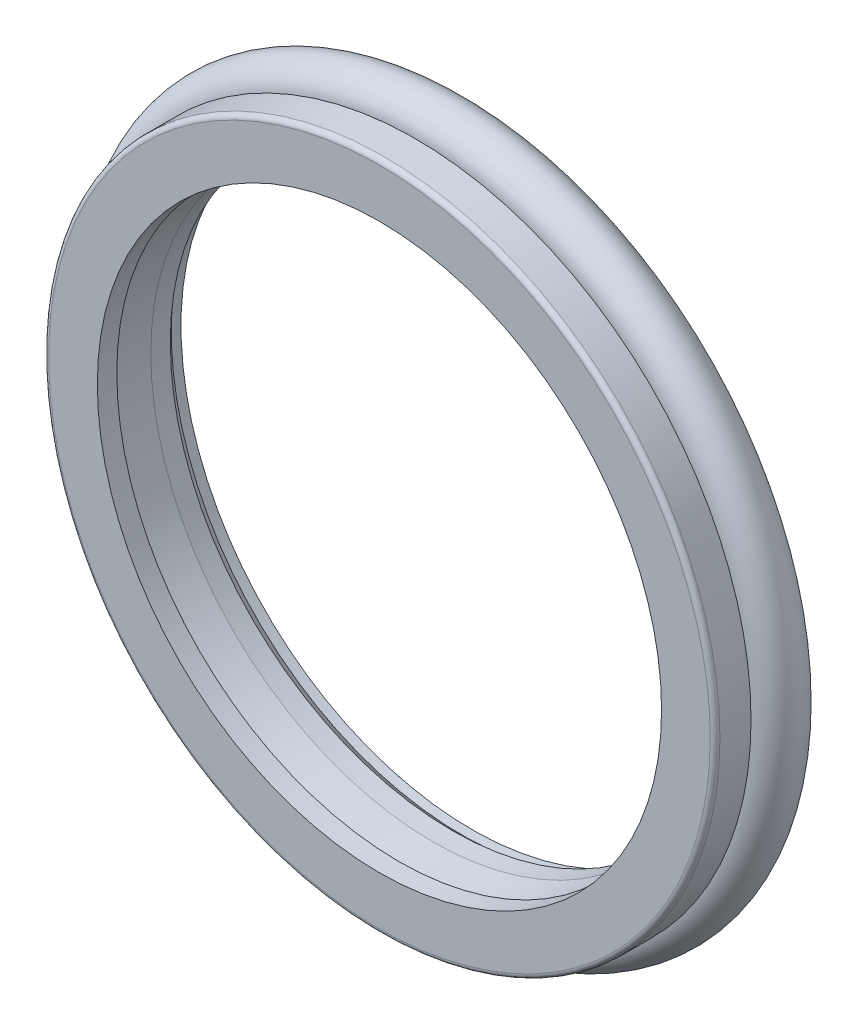
ISO-10303-21;
HEADER;
FILE_DESCRIPTION(('STEP AP214'),'2;1');
FILE_NAME('part.step','',(''),(''),'','','');
FILE_SCHEMA(('AUTOMOTIVE_DESIGN { 1 0 10303 214 1 1 1 1 }'));
ENDSEC;
DATA;
#1=APPLICATION_CONTEXT('core data for automotive mechanical design processes');
#2=APPLICATION_PROTOCOL_DEFINITION('international standard','automotive_design',2000,#1);
#3=PRODUCT_CONTEXT('',#1,'mechanical');
#4=PRODUCT('Part','Part','',(#3));
#5=PRODUCT_RELATED_PRODUCT_CATEGORY('part','',(#4));
#6=PRODUCT_DEFINITION_FORMATION('','',#4);
#7=PRODUCT_DEFINITION_CONTEXT('part definition',#1,'design');
#8=PRODUCT_DEFINITION('design','',#6,#7);
#9=PRODUCT_DEFINITION_SHAPE('','',#8);
#10=(LENGTH_UNIT() NAMED_UNIT(*) SI_UNIT(.MILLI.,.METRE.));
#11=(NAMED_UNIT(*) PLANE_ANGLE_UNIT() SI_UNIT($,.RADIAN.));
#12=(NAMED_UNIT(*) SI_UNIT($,.STERADIAN.) SOLID_ANGLE_UNIT());
#13=UNCERTAINTY_MEASURE_WITH_UNIT(LENGTH_MEASURE(1.E-05),#10,'distance_accuracy_value','');
#14=(GEOMETRIC_REPRESENTATION_CONTEXT(3) GLOBAL_UNCERTAINTY_ASSIGNED_CONTEXT((#13)) GLOBAL_UNIT_ASSIGNED_CONTEXT((#10,
#11,#12)) REPRESENTATION_CONTEXT('',''));
#15=CARTESIAN_POINT('',(0.,0.,0.));
#16=DIRECTION('',(0.,0.,1.));
#17=DIRECTION('',(1.,0.,0.));
#18=AXIS2_PLACEMENT_3D('',#15,#16,#17);
#19=CARTESIAN_POINT('',(0.,0.,-3.3));
#20=DIRECTION('',(0.,0.,1.));
#21=DIRECTION('',(1.,0.,0.));
#22=AXIS2_PLACEMENT_3D('',#19,#20,#21);
#23=TOROIDAL_SURFACE('',#22,17.05,1.3);
#24=CARTESIAN_POINT('',(18.35,0.,-3.3));
#25=VERTEX_POINT('',#24);
#26=VERTEX_LOOP('',#25);
#27=FACE_BOUND('',#26,.T.);
#28=ADVANCED_FACE('F49',(#27),#23,.T.);
#29=CLOSED_SHELL('',(#28));
#30=MANIFOLD_SOLID_BREP('B2',#29);
#31=CARTESIAN_POINT('',(0.,0.,0.));
#32=DIRECTION('',(0.,0.,1.));
#33=DIRECTION('',(1.,0.,0.));
#34=AXIS2_PLACEMENT_3D('',#31,#32,#33);
#35=CYLINDRICAL_SURFACE('',#34,14.5);
#36=CARTESIAN_POINT('',(0.,0.,-1.));
#37=DIRECTION('',(0.,0.,1.));
#38=DIRECTION('',(1.,0.,0.));
#39=AXIS2_PLACEMENT_3D('',#36,#37,#38);
#40=CIRCLE('',#39,14.5);
#41=CARTESIAN_POINT('',(14.5,0.,-1.));
#42=VERTEX_POINT('',#41);
#43=EDGE_CURVE('E48',#42,#42,#40,.T.);
#44=ORIENTED_EDGE('',*,*,#43,.F.);
#45=EDGE_LOOP('',(#44));
#46=FACE_BOUND('',#45,.T.);
#47=CARTESIAN_POINT('',(0.,0.,0.));
#48=DIRECTION('',(0.,0.,1.));
#49=DIRECTION('',(1.,0.,0.));
#50=AXIS2_PLACEMENT_3D('',#47,#48,#49);
#51=CIRCLE('',#50,14.5);
#52=CARTESIAN_POINT('',(14.5,0.,0.));
#53=VERTEX_POINT('',#52);
#54=EDGE_CURVE('E106',#53,#53,#51,.T.);
#55=ORIENTED_EDGE('',*,*,#54,.T.);
#56=EDGE_LOOP('',(#55));
#57=FACE_BOUND('',#56,.T.);
#58=ADVANCED_FACE('F66',(#46,#57),#35,.F.);
#59=CARTESIAN_POINT('',(0.,14.7,-1.));
#60=DIRECTION('',(0.,0.,1.));
#61=DIRECTION('',(1.,0.,0.));
#62=AXIS2_PLACEMENT_3D('',#59,#60,#61);
#63=PLANE('',#62);
#64=CARTESIAN_POINT('',(0.,0.,-1.));
#65=DIRECTION('',(0.,0.,1.));
#66=DIRECTION('',(1.,0.,0.));
#67=AXIS2_PLACEMENT_3D('',#64,#65,#66);
#68=CIRCLE('',#67,14.7);
#69=CARTESIAN_POINT('',(14.7,0.,-1.));
#70=VERTEX_POINT('',#69);
#71=EDGE_CURVE('E72',#70,#70,#68,.T.);
#72=ORIENTED_EDGE('',*,*,#71,.F.);
#73=EDGE_LOOP('',(#72));
#74=FACE_BOUND('',#73,.T.);
#75=ORIENTED_EDGE('',*,*,#43,.T.);
#76=EDGE_LOOP('',(#75));
#77=FACE_BOUND('',#76,.T.);
#78=ADVANCED_FACE('F167',(#74,#77),#63,.F.);
#79=CARTESIAN_POINT('',(0.,0.,-1.));
#80=DIRECTION('',(0.,0.,1.));
#81=DIRECTION('',(1.,0.,0.));
#82=AXIS2_PLACEMENT_3D('',#79,#80,#81);
#83=CONICAL_SURFACE('',#82,14.7,0.113792007143709);
#84=CARTESIAN_POINT('',(0.,0.,-2.75));
#85=DIRECTION('',(0.,0.,1.));
#86=DIRECTION('',(1.,0.,0.));
#87=AXIS2_PLACEMENT_3D('',#84,#85,#86);
#88=CIRCLE('',#87,14.5);
#89=CARTESIAN_POINT('',(14.5,0.,-2.75));
#90=VERTEX_POINT('',#89);
#91=EDGE_CURVE('E76',#90,#90,#88,.T.);
#92=ORIENTED_EDGE('',*,*,#91,.F.);
#93=EDGE_LOOP('',(#92));
#94=FACE_BOUND('',#93,.T.);
#95=ORIENTED_EDGE('',*,*,#71,.T.);
#96=EDGE_LOOP('',(#95));
#97=FACE_BOUND('',#96,.T.);
#98=ADVANCED_FACE('F162',(#94,#97),#83,.F.);
#99=CARTESIAN_POINT('',(0.,0.,0.));
#100=DIRECTION('',(0.,0.,1.));
#101=DIRECTION('',(1.,0.,0.));
#102=AXIS2_PLACEMENT_3D('',#99,#100,#101);
#103=CYLINDRICAL_SURFACE('',#102,14.5);
#104=CARTESIAN_POINT('',(0.,0.,-3.75));
#105=DIRECTION('',(0.,0.,1.));
#106=DIRECTION('',(1.,0.,0.));
#107=AXIS2_PLACEMENT_3D('',#104,#105,#106);
#108=CIRCLE('',#107,14.5);
#109=CARTESIAN_POINT('',(14.5,0.,-3.75));
#110=VERTEX_POINT('',#109);
#111=EDGE_CURVE('E80',#110,#110,#108,.T.);
#112=ORIENTED_EDGE('',*,*,#111,.F.);
#113=EDGE_LOOP('',(#112));
#114=FACE_BOUND('',#113,.T.);
#115=ORIENTED_EDGE('',*,*,#91,.T.);
#116=EDGE_LOOP('',(#115));
#117=FACE_BOUND('',#116,.T.);
#118=ADVANCED_FACE('F156',(#114,#117),#103,.F.);
#119=CARTESIAN_POINT('',(0.,0.,-3.75));
#120=DIRECTION('',(0.,0.,-1.));
#121=DIRECTION('',(-1.,0.,0.));
#122=AXIS2_PLACEMENT_3D('',#119,#120,#121);
#123=CONICAL_SURFACE('',#122,14.5,0.732815101786505);
#124=CARTESIAN_POINT('',(0.,0.,-4.25));
#125=DIRECTION('',(0.,0.,1.));
#126=DIRECTION('',(1.,0.,0.));
#127=AXIS2_PLACEMENT_3D('',#124,#125,#126);
#128=CIRCLE('',#127,14.95);
#129=CARTESIAN_POINT('',(14.95,0.,-4.25));
#130=VERTEX_POINT('',#129);
#131=EDGE_CURVE('E85',#130,#130,#128,.T.);
#132=ORIENTED_EDGE('',*,*,#131,.F.);
#133=EDGE_LOOP('',(#132));
#134=FACE_BOUND('',#133,.T.);
#135=ORIENTED_EDGE('',*,*,#111,.T.);
#136=EDGE_LOOP('',(#135));
#137=FACE_BOUND('',#136,.T.);
#138=ADVANCED_FACE('F150',(#134,#137),#123,.F.);
#139=CARTESIAN_POINT('',(0.,0.,0.));
#140=DIRECTION('',(0.,0.,1.));
#141=DIRECTION('',(1.,0.,0.));
#142=AXIS2_PLACEMENT_3D('',#139,#140,#141);
#143=CYLINDRICAL_SURFACE('',#142,14.95);
#144=CARTESIAN_POINT('',(0.,0.,-4.75));
#145=DIRECTION('',(0.,0.,1.));
#146=DIRECTION('',(1.,0.,0.));
#147=AXIS2_PLACEMENT_3D('',#144,#145,#146);
#148=CIRCLE('',#147,14.95);
#149=CARTESIAN_POINT('',(14.95,0.,-4.75));
#150=VERTEX_POINT('',#149);
#151=EDGE_CURVE('E88',#150,#150,#148,.T.);
#152=ORIENTED_EDGE('',*,*,#151,.F.);
#153=EDGE_LOOP('',(#152));
#154=FACE_BOUND('',#153,.T.);
#155=ORIENTED_EDGE('',*,*,#131,.T.);
#156=EDGE_LOOP('',(#155));
#157=FACE_BOUND('',#156,.T.);
#158=ADVANCED_FACE('F144',(#154,#157),#143,.F.);
#159=CARTESIAN_POINT('',(0.,15.75,-4.75));
#160=DIRECTION('',(0.,0.,1.));
#161=DIRECTION('',(1.,0.,0.));
#162=AXIS2_PLACEMENT_3D('',#159,#160,#161);
#163=PLANE('',#162);
#164=CARTESIAN_POINT('',(0.,0.,-4.75));
#165=DIRECTION('',(0.,0.,1.));
#166=DIRECTION('',(1.,0.,0.));
#167=AXIS2_PLACEMENT_3D('',#164,#165,#166);
#168=CIRCLE('',#167,15.75);
#169=CARTESIAN_POINT('',(15.75,0.,-4.75));
#170=VERTEX_POINT('',#169);
#171=EDGE_CURVE('E91',#170,#170,#168,.T.);
#172=ORIENTED_EDGE('',*,*,#171,.F.);
#173=EDGE_LOOP('',(#172));
#174=FACE_BOUND('',#173,.T.);
#175=ORIENTED_EDGE('',*,*,#151,.T.);
#176=EDGE_LOOP('',(#175));
#177=FACE_BOUND('',#176,.T.);
#178=ADVANCED_FACE('F138',(#174,#177),#163,.F.);
#179=CARTESIAN_POINT('',(0.,0.,0.));
#180=DIRECTION('',(0.,0.,1.));
#181=DIRECTION('',(1.,0.,0.));
#182=AXIS2_PLACEMENT_3D('',#179,#180,#181);
#183=CYLINDRICAL_SURFACE('',#182,15.75);
#184=CARTESIAN_POINT('',(0.,0.,-1.85));
#185=DIRECTION('',(0.,0.,1.));
#186=DIRECTION('',(1.,0.,0.));
#187=AXIS2_PLACEMENT_3D('',#184,#185,#186);
#188=CIRCLE('',#187,15.75);
#189=CARTESIAN_POINT('',(15.75,0.,-1.85));
#190=VERTEX_POINT('',#189);
#191=EDGE_CURVE('E94',#190,#190,#188,.T.);
#192=ORIENTED_EDGE('',*,*,#191,.F.);
#193=EDGE_LOOP('',(#192));
#194=FACE_BOUND('',#193,.T.);
#195=ORIENTED_EDGE('',*,*,#171,.T.);
#196=EDGE_LOOP('',(#195));
#197=FACE_BOUND('',#196,.T.);
#198=ADVANCED_FACE('F132',(#194,#197),#183,.T.);
#199=CARTESIAN_POINT('',(0.,15.75,-1.85));
#200=DIRECTION('',(0.,0.,1.));
#201=DIRECTION('',(1.,0.,0.));
#202=AXIS2_PLACEMENT_3D('',#199,#200,#201);
#203=PLANE('',#202);
#204=CARTESIAN_POINT('',(0.,0.,-1.85));
#205=DIRECTION('',(0.,0.,1.));
#206=DIRECTION('',(1.,0.,0.));
#207=AXIS2_PLACEMENT_3D('',#204,#205,#206);
#208=CIRCLE('',#207,17.25);
#209=CARTESIAN_POINT('',(17.25,0.,-1.85));
#210=VERTEX_POINT('',#209);
#211=EDGE_CURVE('E97',#210,#210,#208,.T.);
#212=ORIENTED_EDGE('',*,*,#211,.F.);
#213=EDGE_LOOP('',(#212));
#214=FACE_BOUND('',#213,.T.);
#215=ORIENTED_EDGE('',*,*,#191,.T.);
#216=EDGE_LOOP('',(#215));
#217=FACE_BOUND('',#216,.T.);
#218=ADVANCED_FACE('F126',(#214,#217),#203,.F.);
#219=CARTESIAN_POINT('',(0.,0.,0.));
#220=DIRECTION('',(0.,0.,1.));
#221=DIRECTION('',(1.,0.,0.));
#222=AXIS2_PLACEMENT_3D('',#219,#220,#221);
#223=CYLINDRICAL_SURFACE('',#222,17.25);
#224=CARTESIAN_POINT('',(0.,0.,-0.25));
#225=DIRECTION('',(0.,0.,1.));
#226=DIRECTION('',(1.,0.,0.));
#227=AXIS2_PLACEMENT_3D('',#224,#225,#226);
#228=CIRCLE('',#227,17.25);
#229=CARTESIAN_POINT('',(17.25,0.,-0.25));
#230=VERTEX_POINT('',#229);
#231=EDGE_CURVE('E100',#230,#230,#228,.T.);
#232=ORIENTED_EDGE('',*,*,#231,.F.);
#233=EDGE_LOOP('',(#232));
#234=FACE_BOUND('',#233,.T.);
#235=ORIENTED_EDGE('',*,*,#211,.T.);
#236=EDGE_LOOP('',(#235));
#237=FACE_BOUND('',#236,.T.);
#238=ADVANCED_FACE('F120',(#234,#237),#223,.T.);
#239=CARTESIAN_POINT('',(0.,0.,-0.25));
#240=DIRECTION('',(0.,0.,1.));
#241=DIRECTION('',(1.,0.,0.));
#242=AXIS2_PLACEMENT_3D('',#239,#240,#241);
#243=TOROIDAL_SURFACE('',#242,17.,0.25);
#244=CARTESIAN_POINT('',(0.,0.,0.));
#245=DIRECTION('',(0.,0.,1.));
#246=DIRECTION('',(1.,0.,0.));
#247=AXIS2_PLACEMENT_3D('',#244,#245,#246);
#248=CIRCLE('',#247,17.);
#249=CARTESIAN_POINT('',(17.,0.,0.));
#250=VERTEX_POINT('',#249);
#251=EDGE_CURVE('E103',#250,#250,#248,.T.);
#252=ORIENTED_EDGE('',*,*,#251,.F.);
#253=EDGE_LOOP('',(#252));
#254=FACE_BOUND('',#253,.T.);
#255=ORIENTED_EDGE('',*,*,#231,.T.);
#256=EDGE_LOOP('',(#255));
#257=FACE_BOUND('',#256,.T.);
#258=ADVANCED_FACE('F114',(#254,#257),#243,.T.);
#259=CARTESIAN_POINT('',(0.,17.,0.));
#260=DIRECTION('',(0.,0.,-1.));
#261=DIRECTION('',(-1.,0.,0.));
#262=AXIS2_PLACEMENT_3D('',#259,#260,#261);
#263=PLANE('',#262);
#264=ORIENTED_EDGE('',*,*,#54,.F.);
#265=EDGE_LOOP('',(#264));
#266=FACE_BOUND('',#265,.T.);
#267=ORIENTED_EDGE('',*,*,#251,.T.);
#268=EDGE_LOOP('',(#267));
#269=FACE_BOUND('',#268,.T.);
#270=ADVANCED_FACE('F111',(#266,#269),#263,.F.);
#271=CLOSED_SHELL('',(#58,#78,#98,#118,#138,#158,#178,#198,#218,#238,#258,#270));
#272=MANIFOLD_SOLID_BREP('B6',#271);
#273=ADVANCED_BREP_SHAPE_REPRESENTATION('',(#18,#30,#272),#14);
#274=SHAPE_DEFINITION_REPRESENTATION(#9,#273);
ENDSEC;
END-ISO-10303-21;
